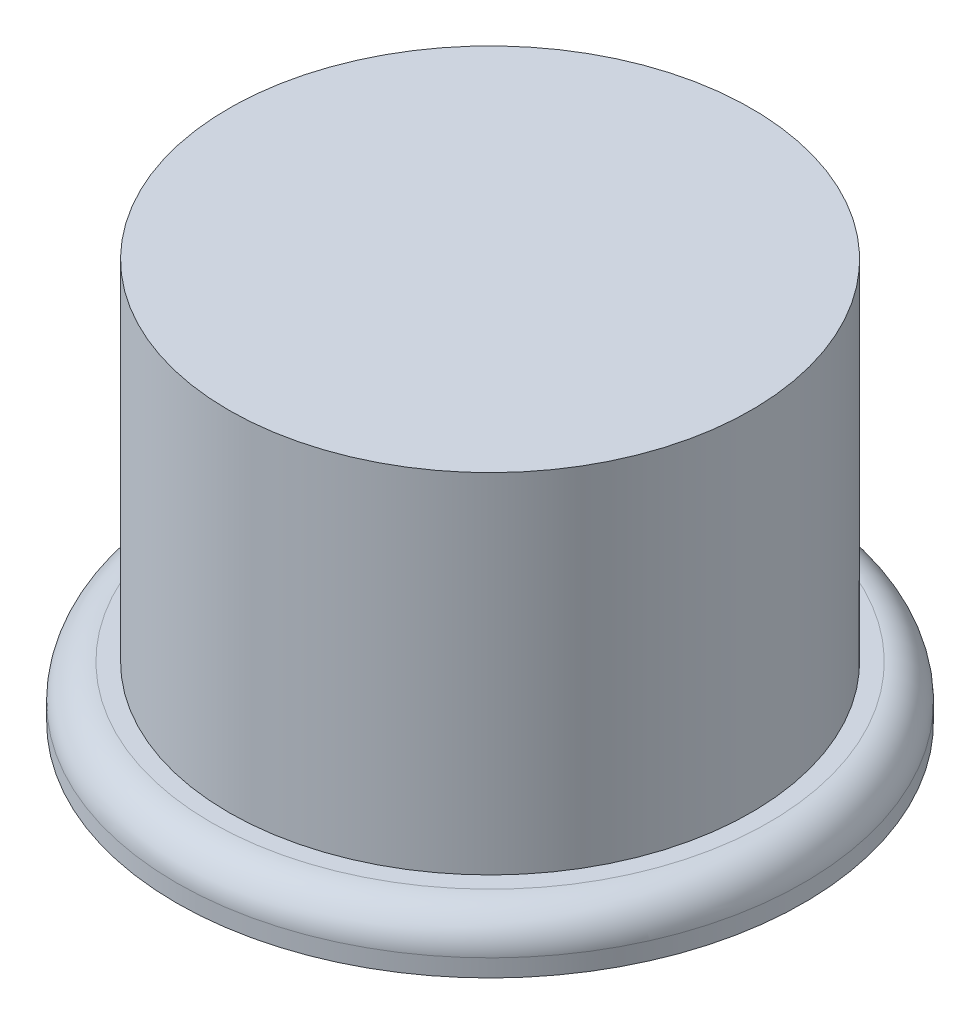
ISO-10303-21;
HEADER;
FILE_DESCRIPTION(('STEP AP214'),'2;1');
FILE_NAME('part.step','',(''),(''),'','','');
FILE_SCHEMA(('AUTOMOTIVE_DESIGN { 1 0 10303 214 1 1 1 1 }'));
ENDSEC;
DATA;
#1=APPLICATION_CONTEXT('core data for automotive mechanical design processes');
#2=APPLICATION_PROTOCOL_DEFINITION('international standard','automotive_design',2000,#1);
#3=PRODUCT_CONTEXT('',#1,'mechanical');
#4=PRODUCT('Part','Part','',(#3));
#5=PRODUCT_RELATED_PRODUCT_CATEGORY('part','',(#4));
#6=PRODUCT_DEFINITION_FORMATION('','',#4);
#7=PRODUCT_DEFINITION_CONTEXT('part definition',#1,'design');
#8=PRODUCT_DEFINITION('design','',#6,#7);
#9=PRODUCT_DEFINITION_SHAPE('','',#8);
#10=(LENGTH_UNIT() NAMED_UNIT(*) SI_UNIT(.MILLI.,.METRE.));
#11=(NAMED_UNIT(*) PLANE_ANGLE_UNIT() SI_UNIT($,.RADIAN.));
#12=(NAMED_UNIT(*) SI_UNIT($,.STERADIAN.) SOLID_ANGLE_UNIT());
#13=UNCERTAINTY_MEASURE_WITH_UNIT(LENGTH_MEASURE(1.E-05),#10,'distance_accuracy_value','');
#14=(GEOMETRIC_REPRESENTATION_CONTEXT(3) GLOBAL_UNCERTAINTY_ASSIGNED_CONTEXT((#13)) GLOBAL_UNIT_ASSIGNED_CONTEXT((#10,
#11,#12)) REPRESENTATION_CONTEXT('',''));
#15=CARTESIAN_POINT('',(0.,0.,0.));
#16=DIRECTION('',(0.,0.,1.));
#17=DIRECTION('',(1.,0.,0.));
#18=AXIS2_PLACEMENT_3D('',#15,#16,#17);
#19=CARTESIAN_POINT('',(0.,1.5,0.));
#20=DIRECTION('',(0.,1.,0.));
#21=DIRECTION('',(0.,0.,1.));
#22=AXIS2_PLACEMENT_3D('',#19,#20,#21);
#23=PLANE('',#22);
#24=CARTESIAN_POINT('',(0.,1.5,0.));
#25=DIRECTION('',(0.,1.,0.));
#26=DIRECTION('',(0.,0.,1.));
#27=AXIS2_PLACEMENT_3D('',#24,#25,#26);
#28=CIRCLE('',#27,8.);
#29=CARTESIAN_POINT('',(0.,1.5,8.));
#30=VERTEX_POINT('',#29);
#31=EDGE_CURVE('E41',#30,#30,#28,.T.);
#32=ORIENTED_EDGE('',*,*,#31,.T.);
#33=EDGE_LOOP('',(#32));
#34=FACE_BOUND('',#33,.T.);
#35=CARTESIAN_POINT('',(0.,1.5,0.));
#36=DIRECTION('',(0.,1.,0.));
#37=DIRECTION('',(0.,0.,1.));
#38=AXIS2_PLACEMENT_3D('',#35,#36,#37);
#39=CIRCLE('',#38,7.5);
#40=CARTESIAN_POINT('',(0.,1.5,7.5));
#41=VERTEX_POINT('',#40);
#42=EDGE_CURVE('E52',#41,#41,#39,.T.);
#43=ORIENTED_EDGE('',*,*,#42,.F.);
#44=EDGE_LOOP('',(#43));
#45=FACE_BOUND('',#44,.T.);
#46=ADVANCED_FACE('F34',(#34,#45),#23,.T.);
#47=CARTESIAN_POINT('',(0.,1.5,0.));
#48=DIRECTION('',(0.,-1.,0.));
#49=DIRECTION('',(0.,0.,-1.));
#50=AXIS2_PLACEMENT_3D('',#47,#48,#49);
#51=CYLINDRICAL_SURFACE('',#50,9.);
#52=CARTESIAN_POINT('',(0.,0.5,0.));
#53=DIRECTION('',(0.,1.,0.));
#54=DIRECTION('',(0.,0.,1.));
#55=AXIS2_PLACEMENT_3D('',#52,#53,#54);
#56=CIRCLE('',#55,9.);
#57=CARTESIAN_POINT('',(0.,0.5,9.));
#58=VERTEX_POINT('',#57);
#59=EDGE_CURVE('E10',#58,#58,#56,.F.);
#60=ORIENTED_EDGE('',*,*,#59,.T.);
#61=EDGE_LOOP('',(#60));
#62=FACE_BOUND('',#61,.T.);
#63=CARTESIAN_POINT('',(0.,0.,0.));
#64=DIRECTION('',(0.,1.,0.));
#65=DIRECTION('',(0.,0.,1.));
#66=AXIS2_PLACEMENT_3D('',#63,#64,#65);
#67=CIRCLE('',#66,9.);
#68=CARTESIAN_POINT('',(0.,0.,9.));
#69=VERTEX_POINT('',#68);
#70=EDGE_CURVE('E45',#69,#69,#67,.T.);
#71=ORIENTED_EDGE('',*,*,#70,.T.);
#72=EDGE_LOOP('',(#71));
#73=FACE_BOUND('',#72,.T.);
#74=ADVANCED_FACE('F67',(#62,#73),#51,.T.);
#75=CARTESIAN_POINT('',(0.,0.,0.));
#76=DIRECTION('',(0.,1.,0.));
#77=DIRECTION('',(0.,0.,1.));
#78=AXIS2_PLACEMENT_3D('',#75,#76,#77);
#79=PLANE('',#78);
#80=ORIENTED_EDGE('',*,*,#70,.F.);
#81=EDGE_LOOP('',(#80));
#82=FACE_BOUND('',#81,.T.);
#83=ADVANCED_FACE('F72',(#82),#79,.F.);
#84=CARTESIAN_POINT('',(0.,0.5,0.));
#85=DIRECTION('',(0.,1.,0.));
#86=DIRECTION('',(0.,0.,1.));
#87=AXIS2_PLACEMENT_3D('',#84,#85,#86);
#88=TOROIDAL_SURFACE('',#87,8.,1.);
#89=ORIENTED_EDGE('',*,*,#59,.F.);
#90=EDGE_LOOP('',(#89));
#91=FACE_BOUND('',#90,.T.);
#92=ORIENTED_EDGE('',*,*,#31,.F.);
#93=EDGE_LOOP('',(#92));
#94=FACE_BOUND('',#93,.T.);
#95=ADVANCED_FACE('F36',(#91,#94),#88,.T.);
#96=CARTESIAN_POINT('',(0.,11.5,0.));
#97=DIRECTION('',(0.,-1.,0.));
#98=DIRECTION('',(0.,0.,-1.));
#99=AXIS2_PLACEMENT_3D('',#96,#97,#98);
#100=CYLINDRICAL_SURFACE('',#99,7.5);
#101=CARTESIAN_POINT('',(0.,11.5,0.));
#102=DIRECTION('',(0.,1.,0.));
#103=DIRECTION('',(0.,0.,1.));
#104=AXIS2_PLACEMENT_3D('',#101,#102,#103);
#105=CIRCLE('',#104,7.5);
#106=CARTESIAN_POINT('',(0.,11.5,7.5));
#107=VERTEX_POINT('',#106);
#108=EDGE_CURVE('E49',#107,#107,#105,.T.);
#109=ORIENTED_EDGE('',*,*,#108,.F.);
#110=EDGE_LOOP('',(#109));
#111=FACE_BOUND('',#110,.T.);
#112=ORIENTED_EDGE('',*,*,#42,.T.);
#113=EDGE_LOOP('',(#112));
#114=FACE_BOUND('',#113,.T.);
#115=ADVANCED_FACE('F60',(#111,#114),#100,.T.);
#116=CARTESIAN_POINT('',(0.,11.5,0.));
#117=DIRECTION('',(0.,1.,0.));
#118=DIRECTION('',(0.,0.,1.));
#119=AXIS2_PLACEMENT_3D('',#116,#117,#118);
#120=PLANE('',#119);
#121=ORIENTED_EDGE('',*,*,#108,.T.);
#122=EDGE_LOOP('',(#121));
#123=FACE_BOUND('',#122,.T.);
#124=ADVANCED_FACE('F58',(#123),#120,.T.);
#125=CLOSED_SHELL('',(#46,#74,#83,#95,#115,#124));
#126=MANIFOLD_SOLID_BREP('B2',#125);
#127=ADVANCED_BREP_SHAPE_REPRESENTATION('',(#18,#126),#14);
#128=SHAPE_DEFINITION_REPRESENTATION(#9,#127);
ENDSEC;
END-ISO-10303-21;
